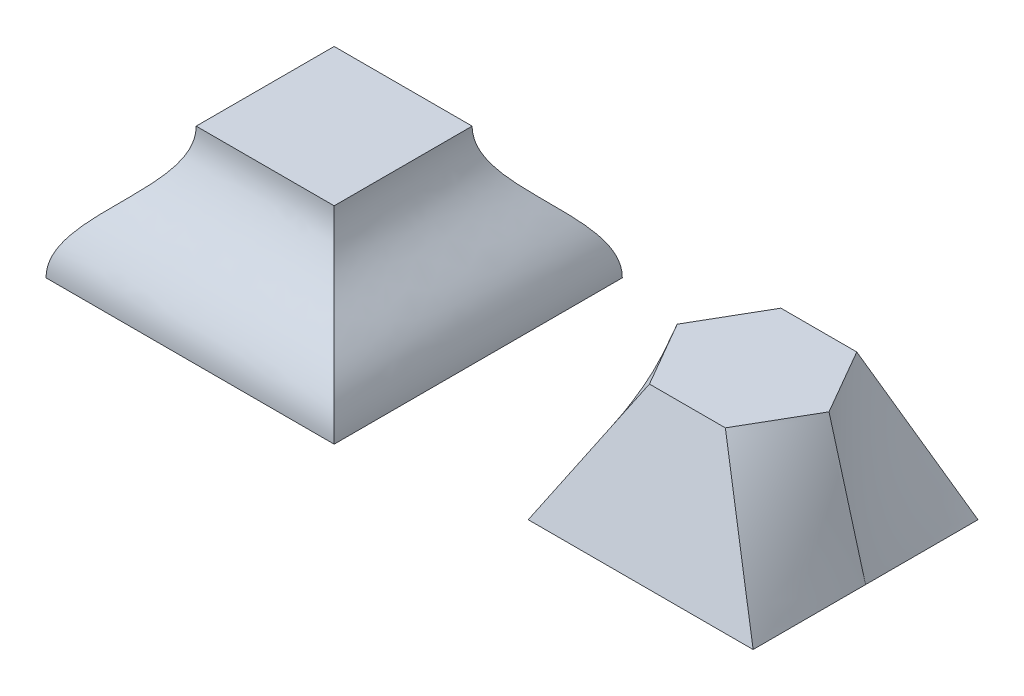
ISO-10303-21;
HEADER;
FILE_DESCRIPTION(('STEP AP214'),'2;1');
FILE_NAME('part.step','',(''),(''),'','','');
FILE_SCHEMA(('AUTOMOTIVE_DESIGN { 1 0 10303 214 1 1 1 1 }'));
ENDSEC;
DATA;
#1=APPLICATION_CONTEXT('core data for automotive mechanical design processes');
#2=APPLICATION_PROTOCOL_DEFINITION('international standard','automotive_design',2000,#1);
#3=PRODUCT_CONTEXT('',#1,'mechanical');
#4=PRODUCT('Part','Part','',(#3));
#5=PRODUCT_RELATED_PRODUCT_CATEGORY('part','',(#4));
#6=PRODUCT_DEFINITION_FORMATION('','',#4);
#7=PRODUCT_DEFINITION_CONTEXT('part definition',#1,'design');
#8=PRODUCT_DEFINITION('design','',#6,#7);
#9=PRODUCT_DEFINITION_SHAPE('','',#8);
#10=(LENGTH_UNIT() NAMED_UNIT(*) SI_UNIT(.MILLI.,.METRE.));
#11=(NAMED_UNIT(*) PLANE_ANGLE_UNIT() SI_UNIT($,.RADIAN.));
#12=(NAMED_UNIT(*) SI_UNIT($,.STERADIAN.) SOLID_ANGLE_UNIT());
#13=UNCERTAINTY_MEASURE_WITH_UNIT(LENGTH_MEASURE(1.E-05),#10,'distance_accuracy_value','');
#14=(GEOMETRIC_REPRESENTATION_CONTEXT(3) GLOBAL_UNCERTAINTY_ASSIGNED_CONTEXT((#13)) GLOBAL_UNIT_ASSIGNED_CONTEXT((#10,
#11,#12)) REPRESENTATION_CONTEXT('',''));
#15=CARTESIAN_POINT('',(0.,0.,0.));
#16=DIRECTION('',(0.,0.,1.));
#17=DIRECTION('',(1.,0.,0.));
#18=AXIS2_PLACEMENT_3D('',#15,#16,#17);
#19=CARTESIAN_POINT('',(0.,0.,0.));
#20=DIRECTION('',(0.,-1.,0.));
#21=DIRECTION('',(0.,0.,-1.));
#22=AXIS2_PLACEMENT_3D('',#19,#20,#21);
#23=PLANE('',#22);
#24=DIRECTION('',(-1.,0.,0.));
#25=VECTOR('',#24,1.);
#26=CARTESIAN_POINT('',(141.555804652702,0.,-29.9529296765848));
#27=LINE('',#26,#25);
#28=CARTESIAN_POINT('',(141.555804652702,0.,-29.9529296765848));
#29=VERTEX_POINT('',#28);
#30=CARTESIAN_POINT('',(81.6499452995324,0.,-29.9529296765848));
#31=VERTEX_POINT('',#30);
#32=EDGE_CURVE('E13',#29,#31,#27,.T.);
#33=ORIENTED_EDGE('',*,*,#32,.F.);
#34=DIRECTION('',(0.,0.,-1.));
#35=VECTOR('',#34,1.);
#36=CARTESIAN_POINT('',(141.555804652702,0.,0.));
#37=LINE('',#36,#35);
#38=CARTESIAN_POINT('',(141.555804652702,0.,0.));
#39=VERTEX_POINT('',#38);
#40=EDGE_CURVE('E165',#39,#29,#37,.T.);
#41=ORIENTED_EDGE('',*,*,#40,.F.);
#42=CARTESIAN_POINT('',(141.555804652702,0.,29.9529296765848));
#43=VERTEX_POINT('',#42);
#44=EDGE_CURVE('E111',#43,#39,#37,.T.);
#45=ORIENTED_EDGE('',*,*,#44,.F.);
#46=DIRECTION('',(1.,0.,0.));
#47=VECTOR('',#46,1.);
#48=CARTESIAN_POINT('',(141.555804652702,0.,29.9529296765848));
#49=LINE('',#48,#47);
#50=CARTESIAN_POINT('',(81.6499452995324,0.,29.9529296765848));
#51=VERTEX_POINT('',#50);
#52=EDGE_CURVE('E127',#51,#43,#49,.T.);
#53=ORIENTED_EDGE('',*,*,#52,.F.);
#54=DIRECTION('',(0.,0.,1.));
#55=VECTOR('',#54,1.);
#56=CARTESIAN_POINT('',(81.6499452995324,0.,0.));
#57=LINE('',#56,#55);
#58=CARTESIAN_POINT('',(81.6499452995324,0.,0.));
#59=VERTEX_POINT('',#58);
#60=EDGE_CURVE('E261',#59,#51,#57,.T.);
#61=ORIENTED_EDGE('',*,*,#60,.F.);
#62=EDGE_CURVE('E311',#31,#59,#57,.T.);
#63=ORIENTED_EDGE('',*,*,#62,.F.);
#64=EDGE_LOOP('',(#33,#41,#45,#53,#61,#63));
#65=FACE_BOUND('',#64,.T.);
#66=ADVANCED_FACE('F101',(#65),#23,.T.);
#67=CARTESIAN_POINT('',(0.,35.,0.));
#68=DIRECTION('',(0.,1.,0.));
#69=DIRECTION('',(0.,0.,1.));
#70=AXIS2_PLACEMENT_3D('',#67,#68,#69);
#71=PLANE('',#70);
#72=DIRECTION('',(-0.5,0.,0.866025403784439));
#73=VECTOR('',#72,1.);
#74=CARTESIAN_POINT('',(101.494332807914,35.,-17.5085086257799));
#75=LINE('',#74,#73);
#76=CARTESIAN_POINT('',(101.494332807914,35.,-17.5085086257799));
#77=VERTEX_POINT('',#76);
#78=CARTESIAN_POINT('',(91.3857906397115,35.,0.));
#79=VERTEX_POINT('',#78);
#80=EDGE_CURVE('E241',#77,#79,#75,.T.);
#81=ORIENTED_EDGE('',*,*,#80,.T.);
#82=DIRECTION('',(0.5,0.,0.866025403784439));
#83=VECTOR('',#82,1.);
#84=CARTESIAN_POINT('',(91.3857906397115,35.,0.));
#85=LINE('',#84,#83);
#86=CARTESIAN_POINT('',(101.494332807914,35.,17.5085086257798));
#87=VERTEX_POINT('',#86);
#88=EDGE_CURVE('E233',#79,#87,#85,.T.);
#89=ORIENTED_EDGE('',*,*,#88,.T.);
#90=DIRECTION('',(1.,0.,0.));
#91=VECTOR('',#90,1.);
#92=CARTESIAN_POINT('',(101.494332807914,35.,17.5085086257798));
#93=LINE('',#92,#91);
#94=CARTESIAN_POINT('',(121.71141714432,35.,17.5085086257798));
#95=VERTEX_POINT('',#94);
#96=EDGE_CURVE('E240',#87,#95,#93,.T.);
#97=ORIENTED_EDGE('',*,*,#96,.T.);
#98=DIRECTION('',(0.500000000000001,0.,-0.866025403784438));
#99=VECTOR('',#98,1.);
#100=CARTESIAN_POINT('',(121.71141714432,35.,17.5085086257798));
#101=LINE('',#100,#99);
#102=CARTESIAN_POINT('',(131.819959312523,35.,0.));
#103=VERTEX_POINT('',#102);
#104=EDGE_CURVE('E184',#95,#103,#101,.T.);
#105=ORIENTED_EDGE('',*,*,#104,.T.);
#106=DIRECTION('',(-0.499999999999999,0.,-0.866025403784439));
#107=VECTOR('',#106,1.);
#108=CARTESIAN_POINT('',(131.819959312523,35.,0.));
#109=LINE('',#108,#107);
#110=CARTESIAN_POINT('',(121.71141714432,35.,-17.5085086257799));
#111=VERTEX_POINT('',#110);
#112=EDGE_CURVE('E162',#103,#111,#109,.T.);
#113=ORIENTED_EDGE('',*,*,#112,.T.);
#114=DIRECTION('',(-1.,0.,0.));
#115=VECTOR('',#114,1.);
#116=CARTESIAN_POINT('',(121.71141714432,35.,-17.5085086257799));
#117=LINE('',#116,#115);
#118=EDGE_CURVE('E168',#111,#77,#117,.T.);
#119=ORIENTED_EDGE('',*,*,#118,.T.);
#120=EDGE_LOOP('',(#81,#89,#97,#105,#113,#119));
#121=FACE_BOUND('',#120,.T.);
#122=ADVANCED_FACE('F182',(#121),#71,.T.);
#123=CARTESIAN_POINT('',(121.71141714432,35.,-17.5085086257799));
#124=CARTESIAN_POINT('',(141.555804652702,0.,-29.9529296765848));
#125=CARTESIAN_POINT('',(123.396174172354,35.,-14.5904238548165));
#126=CARTESIAN_POINT('',(141.555804652702,0.,-24.9607747304873));
#127=CARTESIAN_POINT('',(125.080931200388,35.,-11.6723390838532));
#128=CARTESIAN_POINT('',(141.555804652702,0.,-19.9686197843899));
#129=CARTESIAN_POINT('',(128.450445256455,35.,-5.83616954192662));
#130=CARTESIAN_POINT('',(141.555804652702,0.,-9.98430989219493));
#131=CARTESIAN_POINT('',(130.135202284489,35.,-2.91808477096331));
#132=CARTESIAN_POINT('',(141.555804652702,0.,-4.99215494609747));
#133=CARTESIAN_POINT('',(131.819959312523,35.,0.));
#134=CARTESIAN_POINT('',(141.555804652702,0.,0.));
#135=B_SPLINE_SURFACE_WITH_KNOTS('',3,1,((#123,#124),(#125,#126),(#127,#128),(#129,#130),(#131,
#132),(#133,#134)),.UNSPECIFIED.,.F.,.F.,.F.,(4,2,4),(2,2),(0.,0.5,1.),(0.,1.),.UNSPECIFIED.);
#136=DIRECTION('',(0.267991978543585,-0.963421143340904,0.));
#137=VECTOR('',#136,1.);
#138=CARTESIAN_POINT('',(136.687881982613,17.5,0.));
#139=LINE('',#138,#137);
#140=EDGE_CURVE('E119',#103,#39,#139,.T.);
#141=DIRECTION('',(-0.471196553670778,0.831060135845028,0.29548749282842));
#142=VECTOR('',#141,1.);
#143=CARTESIAN_POINT('',(131.633610898511,17.5,-23.7307191511823));
#144=LINE('',#143,#142);
#145=EDGE_CURVE('E158',#29,#111,#144,.T.);
#146=ORIENTED_EDGE('',*,*,#112,.F.);
#147=ORIENTED_EDGE('',*,*,#140,.T.);
#148=ORIENTED_EDGE('',*,*,#40,.T.);
#149=ORIENTED_EDGE('',*,*,#145,.T.);
#150=EDGE_LOOP('',(#146,#147,#148,#149));
#151=FACE_BOUND('',#150,.T.);
#152=ADVANCED_FACE('F160',(#151),#135,.T.);
#153=CARTESIAN_POINT('',(131.819959312523,35.,0.));
#154=CARTESIAN_POINT('',(141.555804652702,0.,0.));
#155=CARTESIAN_POINT('',(130.135202284489,35.,2.91808477096329));
#156=CARTESIAN_POINT('',(141.555804652702,0.,4.99215494609745));
#157=CARTESIAN_POINT('',(128.450445256455,35.,5.8361695419266));
#158=CARTESIAN_POINT('',(141.555804652702,0.,9.98430989219491));
#159=CARTESIAN_POINT('',(125.080931200388,35.,11.6723390838532));
#160=CARTESIAN_POINT('',(141.555804652702,0.,19.9686197843898));
#161=CARTESIAN_POINT('',(123.396174172354,35.,14.5904238548165));
#162=CARTESIAN_POINT('',(141.555804652702,0.,24.9607747304873));
#163=CARTESIAN_POINT('',(121.71141714432,35.,17.5085086257798));
#164=CARTESIAN_POINT('',(141.555804652702,0.,29.9529296765848));
#165=B_SPLINE_SURFACE_WITH_KNOTS('',3,1,((#153,#154),(#155,#156),(#157,#158),(#159,#160),(#161,
#162),(#163,#164)),.UNSPECIFIED.,.F.,.F.,.F.,(4,2,4),(2,2),(0.,0.5,1.),(0.,1.),.UNSPECIFIED.);
#166=DIRECTION('',(0.471196553670778,-0.831060135845028,0.295487492828419));
#167=VECTOR('',#166,1.);
#168=CARTESIAN_POINT('',(131.633610898511,17.5,23.7307191511823));
#169=LINE('',#168,#167);
#170=EDGE_CURVE('E253',#95,#43,#169,.T.);
#171=ORIENTED_EDGE('',*,*,#104,.F.);
#172=ORIENTED_EDGE('',*,*,#170,.T.);
#173=ORIENTED_EDGE('',*,*,#44,.T.);
#174=ORIENTED_EDGE('',*,*,#140,.F.);
#175=EDGE_LOOP('',(#171,#172,#173,#174));
#176=FACE_BOUND('',#175,.T.);
#177=ADVANCED_FACE('F373',(#176),#165,.T.);
#178=CARTESIAN_POINT('',(0.,9.45465932753132,-26.5912793461928));
#179=DIRECTION('',(0.,0.33500910856767,-0.942214889065491));
#180=DIRECTION('',(0.,0.942214889065491,0.33500910856767));
#181=AXIS2_PLACEMENT_3D('',#178,#179,#180);
#182=PLANE('',#181);
#183=ORIENTED_EDGE('',*,*,#145,.F.);
#184=ORIENTED_EDGE('',*,*,#32,.T.);
#185=DIRECTION('',(-0.471196553670778,-0.831060135845028,-0.295487492828419));
#186=VECTOR('',#185,1.);
#187=CARTESIAN_POINT('',(91.5721390537234,17.5,-23.7307191511823));
#188=LINE('',#187,#186);
#189=EDGE_CURVE('E173',#77,#31,#188,.T.);
#190=ORIENTED_EDGE('',*,*,#189,.F.);
#191=ORIENTED_EDGE('',*,*,#118,.F.);
#192=EDGE_LOOP('',(#183,#184,#190,#191));
#193=FACE_BOUND('',#192,.T.);
#194=ADVANCED_FACE('F172',(#193),#182,.T.);
#195=CARTESIAN_POINT('',(0.,9.45465932753134,26.5912793461928));
#196=DIRECTION('',(0.,0.33500910856767,0.942214889065491));
#197=DIRECTION('',(0.,-0.942214889065491,0.33500910856767));
#198=AXIS2_PLACEMENT_3D('',#195,#196,#197);
#199=PLANE('',#198);
#200=DIRECTION('',(-0.471196553670778,-0.831060135845028,0.29548749282842));
#201=VECTOR('',#200,1.);
#202=CARTESIAN_POINT('',(101.494332807914,35.,17.5085086257798));
#203=LINE('',#202,#201);
#204=EDGE_CURVE('E251',#87,#51,#203,.T.);
#205=ORIENTED_EDGE('',*,*,#204,.T.);
#206=ORIENTED_EDGE('',*,*,#52,.T.);
#207=ORIENTED_EDGE('',*,*,#170,.F.);
#208=ORIENTED_EDGE('',*,*,#96,.F.);
#209=EDGE_LOOP('',(#205,#206,#207,#208));
#210=FACE_BOUND('',#209,.T.);
#211=ADVANCED_FACE('F250',(#210),#199,.T.);
#212=CARTESIAN_POINT('',(101.494332807914,35.,17.5085086257798));
#213=CARTESIAN_POINT('',(81.6499452995324,0.,29.9529296765848));
#214=CARTESIAN_POINT('',(99.8095757798803,35.,14.5904238548161));
#215=CARTESIAN_POINT('',(81.6499452995324,0.,24.9607747304873));
#216=CARTESIAN_POINT('',(98.1248187518464,35.,11.6723390838526));
#217=CARTESIAN_POINT('',(81.6499452995324,0.,19.9686197843899));
#218=CARTESIAN_POINT('',(94.7553046957787,35.,5.83616954192599));
#219=CARTESIAN_POINT('',(81.6499452995324,0.,9.98430989219494));
#220=CARTESIAN_POINT('',(93.0705476677451,35.,2.91808477096288));
#221=CARTESIAN_POINT('',(81.6499452995324,0.,4.99215494609747));
#222=CARTESIAN_POINT('',(91.3857906397115,35.,0.));
#223=CARTESIAN_POINT('',(81.6499452995324,0.,0.));
#224=B_SPLINE_SURFACE_WITH_KNOTS('',3,1,((#212,#213),(#214,#215),(#216,#217),(#218,#219),(#220,
#221),(#222,#223)),.UNSPECIFIED.,.F.,.F.,.F.,(4,2,4),(2,2),(0.,0.5,1.),(0.,1.),.UNSPECIFIED.);
#225=DIRECTION('',(-0.267991978543585,-0.963421143340904,0.));
#226=VECTOR('',#225,1.);
#227=CARTESIAN_POINT('',(86.517867969622,17.5,0.));
#228=LINE('',#227,#226);
#229=EDGE_CURVE('E263',#79,#59,#228,.T.);
#230=ORIENTED_EDGE('',*,*,#88,.F.);
#231=ORIENTED_EDGE('',*,*,#229,.T.);
#232=ORIENTED_EDGE('',*,*,#60,.T.);
#233=ORIENTED_EDGE('',*,*,#204,.F.);
#234=EDGE_LOOP('',(#230,#231,#232,#233));
#235=FACE_BOUND('',#234,.T.);
#236=ADVANCED_FACE('F257',(#235),#224,.T.);
#237=CARTESIAN_POINT('',(91.3857906397115,35.,0.));
#238=CARTESIAN_POINT('',(81.6499452995324,0.,0.));
#239=CARTESIAN_POINT('',(93.0705476677453,35.,-2.91808477096337));
#240=CARTESIAN_POINT('',(81.6499452995324,0.,-4.99215494609747));
#241=CARTESIAN_POINT('',(94.7553046957791,35.,-5.83616954192669));
#242=CARTESIAN_POINT('',(81.6499452995324,0.,-9.98430989219494));
#243=CARTESIAN_POINT('',(98.1248187518467,35.,-11.6723390838533));
#244=CARTESIAN_POINT('',(81.6499452995324,0.,-19.9686197843899));
#245=CARTESIAN_POINT('',(99.8095757798805,35.,-14.5904238548166));
#246=CARTESIAN_POINT('',(81.6499452995324,0.,-24.9607747304873));
#247=CARTESIAN_POINT('',(101.494332807914,35.,-17.5085086257799));
#248=CARTESIAN_POINT('',(81.6499452995324,0.,-29.9529296765848));
#249=B_SPLINE_SURFACE_WITH_KNOTS('',3,1,((#237,#238),(#239,#240),(#241,#242),(#243,#244),(#245,
#246),(#247,#248)),.UNSPECIFIED.,.F.,.F.,.F.,(4,2,4),(2,2),(0.,0.5,1.),(0.,1.),.UNSPECIFIED.);
#250=ORIENTED_EDGE('',*,*,#80,.F.);
#251=ORIENTED_EDGE('',*,*,#189,.T.);
#252=ORIENTED_EDGE('',*,*,#62,.T.);
#253=ORIENTED_EDGE('',*,*,#229,.F.);
#254=EDGE_LOOP('',(#250,#251,#252,#253));
#255=FACE_BOUND('',#254,.T.);
#256=ADVANCED_FACE('F286',(#255),#249,.T.);
#257=CLOSED_SHELL('',(#66,#122,#152,#177,#194,#211,#236,#256));
#258=MANIFOLD_SOLID_BREP('B2',#257);
#259=CARTESIAN_POINT('',(0.,35.,0.));
#260=DIRECTION('',(0.,-1.,0.));
#261=DIRECTION('',(0.,0.,-1.));
#262=AXIS2_PLACEMENT_3D('',#259,#260,#261);
#263=PLANE('',#262);
#264=DIRECTION('',(0.,0.,-1.));
#265=VECTOR('',#264,1.);
#266=CARTESIAN_POINT('',(18.3806968299075,35.,18.3806968299075));
#267=LINE('',#266,#265);
#268=CARTESIAN_POINT('',(18.3806968299075,35.,18.3806968299075));
#269=VERTEX_POINT('',#268);
#270=CARTESIAN_POINT('',(18.3806968299075,35.,-18.3806968299075));
#271=VERTEX_POINT('',#270);
#272=EDGE_CURVE('E631',#269,#271,#267,.T.);
#273=ORIENTED_EDGE('',*,*,#272,.T.);
#274=DIRECTION('',(-1.,0.,0.));
#275=VECTOR('',#274,1.);
#276=CARTESIAN_POINT('',(-18.3806968299075,35.,-18.3806968299075));
#277=LINE('',#276,#275);
#278=CARTESIAN_POINT('',(-18.3806968299075,35.,-18.3806968299075));
#279=VERTEX_POINT('',#278);
#280=EDGE_CURVE('E716',#271,#279,#277,.T.);
#281=ORIENTED_EDGE('',*,*,#280,.T.);
#282=DIRECTION('',(0.,0.,1.));
#283=VECTOR('',#282,1.);
#284=CARTESIAN_POINT('',(-18.3806968299075,35.,18.3806968299075));
#285=LINE('',#284,#283);
#286=CARTESIAN_POINT('',(-18.3806968299075,35.,18.3806968299075));
#287=VERTEX_POINT('',#286);
#288=EDGE_CURVE('E589',#279,#287,#285,.T.);
#289=ORIENTED_EDGE('',*,*,#288,.T.);
#290=DIRECTION('',(1.,0.,0.));
#291=VECTOR('',#290,1.);
#292=CARTESIAN_POINT('',(-18.3806968299075,35.,18.3806968299075));
#293=LINE('',#292,#291);
#294=EDGE_CURVE('E99',#287,#269,#293,.T.);
#295=ORIENTED_EDGE('',*,*,#294,.T.);
#296=EDGE_LOOP('',(#273,#281,#289,#295));
#297=FACE_BOUND('',#296,.T.);
#298=ADVANCED_FACE('F579',(#297),#263,.F.);
#299=CARTESIAN_POINT('',(0.,0.,0.));
#300=DIRECTION('',(0.,1.,0.));
#301=DIRECTION('',(0.,0.,1.));
#302=AXIS2_PLACEMENT_3D('',#299,#300,#301);
#303=PLANE('',#302);
#304=DIRECTION('',(0.,0.,1.));
#305=VECTOR('',#304,1.);
#306=CARTESIAN_POINT('',(-38.3806968299075,0.,38.3806968299075));
#307=LINE('',#306,#305);
#308=CARTESIAN_POINT('',(-38.3806968299075,0.,-38.3806968299075));
#309=VERTEX_POINT('',#308);
#310=CARTESIAN_POINT('',(-38.3806968299075,0.,38.3806968299075));
#311=VERTEX_POINT('',#310);
#312=EDGE_CURVE('E688',#309,#311,#307,.T.);
#313=ORIENTED_EDGE('',*,*,#312,.F.);
#314=DIRECTION('',(-1.,0.,0.));
#315=VECTOR('',#314,1.);
#316=CARTESIAN_POINT('',(38.3806968299075,0.,-38.3806968299075));
#317=LINE('',#316,#315);
#318=CARTESIAN_POINT('',(38.3806968299075,0.,-38.3806968299075));
#319=VERTEX_POINT('',#318);
#320=EDGE_CURVE('E647',#319,#309,#317,.T.);
#321=ORIENTED_EDGE('',*,*,#320,.F.);
#322=DIRECTION('',(0.,0.,-1.));
#323=VECTOR('',#322,1.);
#324=CARTESIAN_POINT('',(38.3806968299075,0.,38.3806968299075));
#325=LINE('',#324,#323);
#326=CARTESIAN_POINT('',(38.3806968299075,0.,38.3806968299075));
#327=VERTEX_POINT('',#326);
#328=EDGE_CURVE('E628',#327,#319,#325,.T.);
#329=ORIENTED_EDGE('',*,*,#328,.F.);
#330=DIRECTION('',(1.,0.,0.));
#331=VECTOR('',#330,1.);
#332=CARTESIAN_POINT('',(38.3806968299075,0.,38.3806968299075));
#333=LINE('',#332,#331);
#334=EDGE_CURVE('E636',#311,#327,#333,.T.);
#335=ORIENTED_EDGE('',*,*,#334,.F.);
#336=EDGE_LOOP('',(#313,#321,#329,#335));
#337=FACE_BOUND('',#336,.T.);
#338=ADVANCED_FACE('F646',(#337),#303,.F.);
#339=CARTESIAN_POINT('',(-38.3806968299075,0.,38.3806968299075));
#340=CARTESIAN_POINT('',(-38.3806968299075,15.,38.3806968299075));
#341=CARTESIAN_POINT('',(-18.3806968299075,20.,18.3806968299075));
#342=CARTESIAN_POINT('',(-18.3806968299075,35.,18.3806968299075));
#343=CARTESIAN_POINT('',(-12.7935656099692,0.,38.3806968299075));
#344=CARTESIAN_POINT('',(-12.7935656099692,15.,38.3806968299075));
#345=CARTESIAN_POINT('',(-6.12689894330249,20.,18.3806968299075));
#346=CARTESIAN_POINT('',(-6.12689894330249,35.,18.3806968299075));
#347=CARTESIAN_POINT('',(12.7935656099692,0.,38.3806968299075));
#348=CARTESIAN_POINT('',(12.7935656099692,15.,38.3806968299075));
#349=CARTESIAN_POINT('',(6.1268989433025,20.,18.3806968299075));
#350=CARTESIAN_POINT('',(6.1268989433025,35.,18.3806968299075));
#351=CARTESIAN_POINT('',(38.3806968299075,0.,38.3806968299075));
#352=CARTESIAN_POINT('',(38.3806968299075,15.,38.3806968299075));
#353=CARTESIAN_POINT('',(18.3806968299075,20.,18.3806968299075));
#354=CARTESIAN_POINT('',(18.3806968299075,35.,18.3806968299075));
#355=B_SPLINE_SURFACE_WITH_KNOTS('',3,3,((#339,#340,#341,#342),(#343,#344,#345,#346),(#347,#348,
#349,#350),(#351,#352,#353,#354)),.UNSPECIFIED.,.F.,.F.,.F.,(4,4),(4,4),(0.,1.),(0.,1.),.UNSPECIFIED.);
#356=CARTESIAN_POINT('',(38.3806968299075,0.,38.3806968299075));
#357=CARTESIAN_POINT('',(38.3806968299075,15.,38.3806968299075));
#358=CARTESIAN_POINT('',(18.3806968299075,20.,18.3806968299075));
#359=CARTESIAN_POINT('',(18.3806968299075,35.,18.3806968299075));
#360=B_SPLINE_CURVE_WITH_KNOTS('',3,(#356,#357,#358,#359),.UNSPECIFIED.,.F.,.F.,(4,4),(0.,1.),.UNSPECIFIED.);
#361=EDGE_CURVE('E623',#327,#269,#360,.T.);
#362=CARTESIAN_POINT('',(-38.3806968299075,0.,38.3806968299075));
#363=CARTESIAN_POINT('',(-38.3806968299075,15.,38.3806968299075));
#364=CARTESIAN_POINT('',(-18.3806968299075,20.,18.3806968299075));
#365=CARTESIAN_POINT('',(-18.3806968299075,35.,18.3806968299075));
#366=B_SPLINE_CURVE_WITH_KNOTS('',3,(#362,#363,#364,#365),.UNSPECIFIED.,.F.,.F.,(4,4),(0.,1.),.UNSPECIFIED.);
#367=EDGE_CURVE('E604',#287,#311,#366,.F.);
#368=ORIENTED_EDGE('',*,*,#334,.T.);
#369=ORIENTED_EDGE('',*,*,#361,.T.);
#370=ORIENTED_EDGE('',*,*,#294,.F.);
#371=ORIENTED_EDGE('',*,*,#367,.T.);
#372=EDGE_LOOP('',(#368,#369,#370,#371));
#373=FACE_BOUND('',#372,.T.);
#374=ADVANCED_FACE('F638',(#373),#355,.T.);
#375=CARTESIAN_POINT('',(38.3806968299075,0.,38.3806968299075));
#376=CARTESIAN_POINT('',(38.3806968299075,15.,38.3806968299075));
#377=CARTESIAN_POINT('',(18.3806968299075,20.,18.3806968299075));
#378=CARTESIAN_POINT('',(18.3806968299075,35.,18.3806968299075));
#379=CARTESIAN_POINT('',(38.3806968299075,0.,12.7935656099692));
#380=CARTESIAN_POINT('',(38.3806968299075,15.,12.7935656099692));
#381=CARTESIAN_POINT('',(18.3806968299075,20.,6.1268989433025));
#382=CARTESIAN_POINT('',(18.3806968299075,35.,6.1268989433025));
#383=CARTESIAN_POINT('',(38.3806968299075,0.,-12.7935656099692));
#384=CARTESIAN_POINT('',(38.3806968299075,15.,-12.7935656099692));
#385=CARTESIAN_POINT('',(18.3806968299075,20.,-6.12689894330249));
#386=CARTESIAN_POINT('',(18.3806968299075,35.,-6.12689894330249));
#387=CARTESIAN_POINT('',(38.3806968299075,0.,-38.3806968299075));
#388=CARTESIAN_POINT('',(38.3806968299075,15.,-38.3806968299075));
#389=CARTESIAN_POINT('',(18.3806968299075,20.,-18.3806968299075));
#390=CARTESIAN_POINT('',(18.3806968299075,35.,-18.3806968299075));
#391=B_SPLINE_SURFACE_WITH_KNOTS('',3,3,((#375,#376,#377,#378),(#379,#380,#381,#382),(#383,#384,
#385,#386),(#387,#388,#389,#390)),.UNSPECIFIED.,.F.,.F.,.F.,(4,4),(4,4),(0.,1.),(0.,1.),.UNSPECIFIED.);
#392=CARTESIAN_POINT('',(38.3806968299075,0.,-38.3806968299075));
#393=CARTESIAN_POINT('',(38.3806968299075,15.,-38.3806968299075));
#394=CARTESIAN_POINT('',(18.3806968299075,20.,-18.3806968299075));
#395=CARTESIAN_POINT('',(18.3806968299075,35.,-18.3806968299075));
#396=B_SPLINE_CURVE_WITH_KNOTS('',3,(#392,#393,#394,#395),.UNSPECIFIED.,.F.,.F.,(4,4),(0.,1.),.UNSPECIFIED.);
#397=EDGE_CURVE('E634',#319,#271,#396,.T.);
#398=ORIENTED_EDGE('',*,*,#328,.T.);
#399=ORIENTED_EDGE('',*,*,#397,.T.);
#400=ORIENTED_EDGE('',*,*,#272,.F.);
#401=ORIENTED_EDGE('',*,*,#361,.F.);
#402=EDGE_LOOP('',(#398,#399,#400,#401));
#403=FACE_BOUND('',#402,.T.);
#404=ADVANCED_FACE('F625',(#403),#391,.T.);
#405=CARTESIAN_POINT('',(-38.3806968299075,0.,-38.3806968299075));
#406=CARTESIAN_POINT('',(-38.3806968299075,15.,-38.3806968299075));
#407=CARTESIAN_POINT('',(-18.3806968299075,20.,-18.3806968299075));
#408=CARTESIAN_POINT('',(-18.3806968299075,35.,-18.3806968299075));
#409=CARTESIAN_POINT('',(-38.3806968299075,0.,-12.7935656099692));
#410=CARTESIAN_POINT('',(-38.3806968299075,15.,-12.7935656099692));
#411=CARTESIAN_POINT('',(-18.3806968299075,20.,-6.12689894330249));
#412=CARTESIAN_POINT('',(-18.3806968299075,35.,-6.12689894330249));
#413=CARTESIAN_POINT('',(-38.3806968299075,0.,12.7935656099692));
#414=CARTESIAN_POINT('',(-38.3806968299075,15.,12.7935656099692));
#415=CARTESIAN_POINT('',(-18.3806968299075,20.,6.1268989433025));
#416=CARTESIAN_POINT('',(-18.3806968299075,35.,6.1268989433025));
#417=CARTESIAN_POINT('',(-38.3806968299075,0.,38.3806968299075));
#418=CARTESIAN_POINT('',(-38.3806968299075,15.,38.3806968299075));
#419=CARTESIAN_POINT('',(-18.3806968299075,20.,18.3806968299075));
#420=CARTESIAN_POINT('',(-18.3806968299075,35.,18.3806968299075));
#421=B_SPLINE_SURFACE_WITH_KNOTS('',3,3,((#405,#406,#407,#408),(#409,#410,#411,#412),(#413,#414,
#415,#416),(#417,#418,#419,#420)),.UNSPECIFIED.,.F.,.F.,.F.,(4,4),(4,4),(0.,1.),(0.,1.),.UNSPECIFIED.);
#422=CARTESIAN_POINT('',(-38.3806968299075,0.,-38.3806968299075));
#423=CARTESIAN_POINT('',(-38.3806968299075,15.,-38.3806968299075));
#424=CARTESIAN_POINT('',(-18.3806968299075,20.,-18.3806968299075));
#425=CARTESIAN_POINT('',(-18.3806968299075,35.,-18.3806968299075));
#426=B_SPLINE_CURVE_WITH_KNOTS('',3,(#422,#423,#424,#425),.UNSPECIFIED.,.F.,.F.,(4,4),(0.,1.),.UNSPECIFIED.);
#427=EDGE_CURVE('E723',#309,#279,#426,.T.);
#428=ORIENTED_EDGE('',*,*,#312,.T.);
#429=ORIENTED_EDGE('',*,*,#367,.F.);
#430=ORIENTED_EDGE('',*,*,#288,.F.);
#431=ORIENTED_EDGE('',*,*,#427,.F.);
#432=EDGE_LOOP('',(#428,#429,#430,#431));
#433=FACE_BOUND('',#432,.T.);
#434=ADVANCED_FACE('F755',(#433),#421,.T.);
#435=CARTESIAN_POINT('',(38.3806968299075,0.,-38.3806968299075));
#436=CARTESIAN_POINT('',(38.3806968299075,15.,-38.3806968299075));
#437=CARTESIAN_POINT('',(18.3806968299075,20.,-18.3806968299075));
#438=CARTESIAN_POINT('',(18.3806968299075,35.,-18.3806968299075));
#439=CARTESIAN_POINT('',(12.7935656099692,0.,-38.3806968299075));
#440=CARTESIAN_POINT('',(12.7935656099692,15.,-38.3806968299075));
#441=CARTESIAN_POINT('',(6.1268989433025,20.,-18.3806968299075));
#442=CARTESIAN_POINT('',(6.1268989433025,35.,-18.3806968299075));
#443=CARTESIAN_POINT('',(-12.7935656099692,0.,-38.3806968299075));
#444=CARTESIAN_POINT('',(-12.7935656099692,15.,-38.3806968299075));
#445=CARTESIAN_POINT('',(-6.12689894330249,20.,-18.3806968299075));
#446=CARTESIAN_POINT('',(-6.12689894330249,35.,-18.3806968299075));
#447=CARTESIAN_POINT('',(-38.3806968299075,0.,-38.3806968299075));
#448=CARTESIAN_POINT('',(-38.3806968299075,15.,-38.3806968299075));
#449=CARTESIAN_POINT('',(-18.3806968299075,20.,-18.3806968299075));
#450=CARTESIAN_POINT('',(-18.3806968299075,35.,-18.3806968299075));
#451=B_SPLINE_SURFACE_WITH_KNOTS('',3,3,((#435,#436,#437,#438),(#439,#440,#441,#442),(#443,#444,
#445,#446),(#447,#448,#449,#450)),.UNSPECIFIED.,.F.,.F.,.F.,(4,4),(4,4),(0.,1.),(0.,1.),.UNSPECIFIED.);
#452=ORIENTED_EDGE('',*,*,#320,.T.);
#453=ORIENTED_EDGE('',*,*,#427,.T.);
#454=ORIENTED_EDGE('',*,*,#280,.F.);
#455=ORIENTED_EDGE('',*,*,#397,.F.);
#456=EDGE_LOOP('',(#452,#453,#454,#455));
#457=FACE_BOUND('',#456,.T.);
#458=ADVANCED_FACE('F765',(#457),#451,.T.);
#459=CLOSED_SHELL('',(#298,#338,#374,#404,#434,#458));
#460=MANIFOLD_SOLID_BREP('B7',#459);
#461=ADVANCED_BREP_SHAPE_REPRESENTATION('',(#18,#258,#460),#14);
#462=SHAPE_DEFINITION_REPRESENTATION(#9,#461);
ENDSEC;
END-ISO-10303-21;
